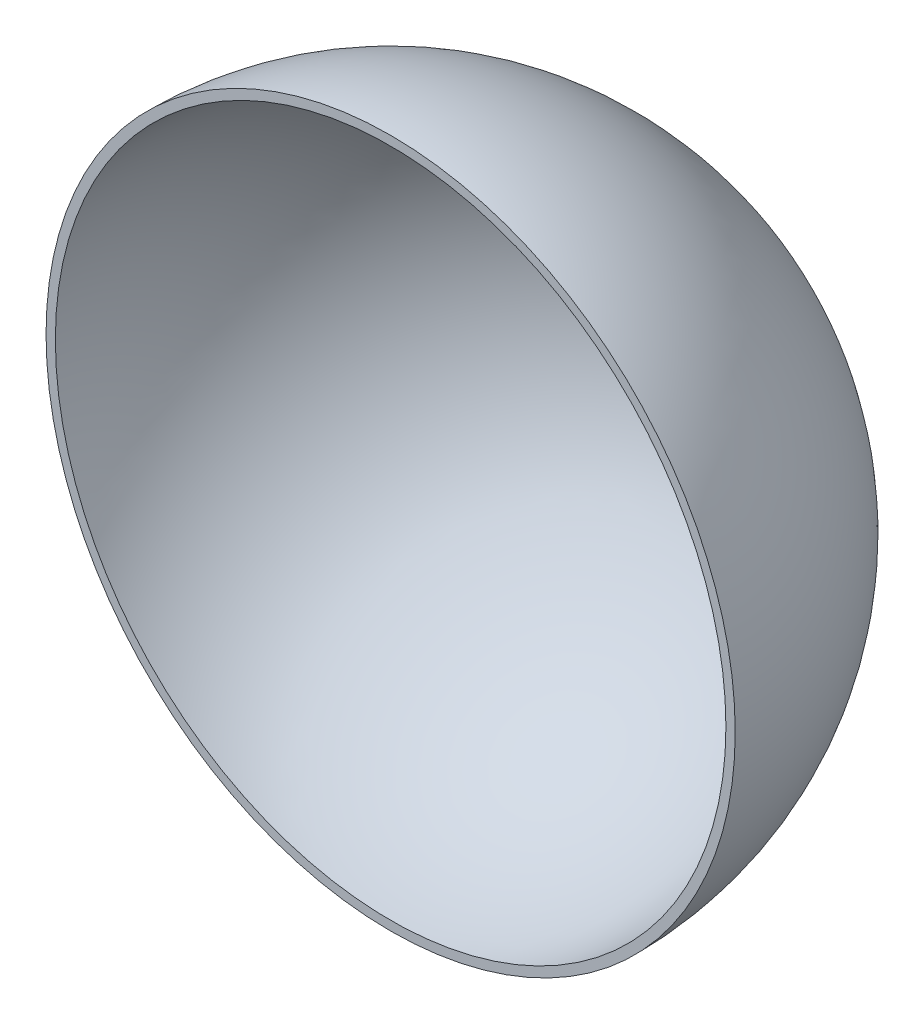
ISO-10303-21;
HEADER;
FILE_DESCRIPTION(('STEP AP214'),'2;1');
FILE_NAME('part.step','',(''),(''),'','','');
FILE_SCHEMA(('AUTOMOTIVE_DESIGN { 1 0 10303 214 1 1 1 1 }'));
ENDSEC;
DATA;
#1=APPLICATION_CONTEXT('core data for automotive mechanical design processes');
#2=APPLICATION_PROTOCOL_DEFINITION('international standard','automotive_design',2000,#1);
#3=PRODUCT_CONTEXT('',#1,'mechanical');
#4=PRODUCT('Part','Part','',(#3));
#5=PRODUCT_RELATED_PRODUCT_CATEGORY('part','',(#4));
#6=PRODUCT_DEFINITION_FORMATION('','',#4);
#7=PRODUCT_DEFINITION_CONTEXT('part definition',#1,'design');
#8=PRODUCT_DEFINITION('design','',#6,#7);
#9=PRODUCT_DEFINITION_SHAPE('','',#8);
#10=(LENGTH_UNIT() NAMED_UNIT(*) SI_UNIT(.MILLI.,.METRE.));
#11=(NAMED_UNIT(*) PLANE_ANGLE_UNIT() SI_UNIT($,.RADIAN.));
#12=(NAMED_UNIT(*) SI_UNIT($,.STERADIAN.) SOLID_ANGLE_UNIT());
#13=UNCERTAINTY_MEASURE_WITH_UNIT(LENGTH_MEASURE(1.E-05),#10,'distance_accuracy_value','');
#14=(GEOMETRIC_REPRESENTATION_CONTEXT(3) GLOBAL_UNCERTAINTY_ASSIGNED_CONTEXT((#13)) GLOBAL_UNIT_ASSIGNED_CONTEXT((#10,
#11,#12)) REPRESENTATION_CONTEXT('',''));
#15=CARTESIAN_POINT('',(0.,0.,0.));
#16=DIRECTION('',(0.,0.,1.));
#17=DIRECTION('',(1.,0.,0.));
#18=AXIS2_PLACEMENT_3D('',#15,#16,#17);
#19=CARTESIAN_POINT('',(0.,0.,0.));
#20=DIRECTION('',(0.,-1.,0.));
#21=DIRECTION('',(1.,0.,0.));
#22=AXIS2_PLACEMENT_3D('',#19,#20,#21);
#23=SPHERICAL_SURFACE('',#22,234.95);
#24=CARTESIAN_POINT('',(0.,0.,0.));
#25=DIRECTION('',(0.,0.,1.));
#26=DIRECTION('',(1.,0.,0.));
#27=AXIS2_PLACEMENT_3D('',#24,#25,#26);
#28=SPHERICAL_SURFACE('',#27,234.95);
#29=CARTESIAN_POINT('',(0.,0.,-234.864173513118));
#30=DIRECTION('',(0.,0.,1.));
#31=DIRECTION('',(1.,0.,0.));
#32=AXIS2_PLACEMENT_3D('',#29,#30,#31);
#33=CIRCLE('',#32,6.35);
#34=CARTESIAN_POINT('',(6.35,0.,-234.864173513118));
#35=VERTEX_POINT('',#34);
#36=EDGE_CURVE('E57',#35,#35,#33,.T.);
#37=ORIENTED_EDGE('',*,*,#36,.T.);
#38=EDGE_LOOP('',(#37));
#39=FACE_BOUND('',#38,.T.);
#40=CARTESIAN_POINT('',(0.,0.,0.));
#41=DIRECTION('',(0.,0.,-1.));
#42=DIRECTION('',(-1.,0.,0.));
#43=AXIS2_PLACEMENT_3D('',#40,#41,#42);
#44=CIRCLE('',#43,234.95);
#45=CARTESIAN_POINT('',(-234.95,0.,1.64064708112239E-12));
#46=VERTEX_POINT('',#45);
#47=EDGE_CURVE('E52',#46,#46,#44,.F.);
#48=ORIENTED_EDGE('',*,*,#47,.F.);
#49=EDGE_LOOP('',(#48));
#50=FACE_BOUND('',#49,.T.);
#51=ADVANCED_FACE('F43',(#39,#50),#28,.T.);
#52=CARTESIAN_POINT('',(0.,0.,0.));
#53=DIRECTION('',(0.,-1.,0.));
#54=DIRECTION('',(1.,0.,0.));
#55=AXIS2_PLACEMENT_3D('',#52,#53,#54);
#56=SPHERICAL_SURFACE('',#55,228.6);
#57=CARTESIAN_POINT('',(0.,0.,0.));
#58=DIRECTION('',(0.,0.,1.));
#59=DIRECTION('',(1.,0.,0.));
#60=AXIS2_PLACEMENT_3D('',#57,#58,#59);
#61=SPHERICAL_SURFACE('',#60,228.6);
#62=CARTESIAN_POINT('',(0.,0.,-228.511788536172));
#63=DIRECTION('',(0.,0.,1.));
#64=DIRECTION('',(1.,0.,0.));
#65=AXIS2_PLACEMENT_3D('',#62,#63,#64);
#66=CIRCLE('',#65,6.35);
#67=CARTESIAN_POINT('',(6.35,0.,-228.511788536172));
#68=VERTEX_POINT('',#67);
#69=EDGE_CURVE('E47',#68,#68,#66,.F.);
#70=ORIENTED_EDGE('',*,*,#69,.T.);
#71=EDGE_LOOP('',(#70));
#72=FACE_BOUND('',#71,.T.);
#73=CARTESIAN_POINT('',(0.,0.,0.));
#74=DIRECTION('',(0.,0.,-1.));
#75=DIRECTION('',(-1.,0.,0.));
#76=AXIS2_PLACEMENT_3D('',#73,#74,#75);
#77=CIRCLE('',#76,228.6);
#78=CARTESIAN_POINT('',(-228.6,0.,1.59630526811908E-12));
#79=VERTEX_POINT('',#78);
#80=EDGE_CURVE('E10',#79,#79,#77,.T.);
#81=ORIENTED_EDGE('',*,*,#80,.F.);
#82=EDGE_LOOP('',(#81));
#83=FACE_BOUND('',#82,.T.);
#84=ADVANCED_FACE('F45',(#72,#83),#61,.F.);
#85=CARTESIAN_POINT('',(0.,0.,0.));
#86=DIRECTION('',(0.,0.,-1.));
#87=DIRECTION('',(-1.,0.,0.));
#88=AXIS2_PLACEMENT_3D('',#85,#86,#87);
#89=PLANE('',#88);
#90=ORIENTED_EDGE('',*,*,#47,.T.);
#91=EDGE_LOOP('',(#90));
#92=FACE_BOUND('',#91,.T.);
#93=ORIENTED_EDGE('',*,*,#80,.T.);
#94=EDGE_LOOP('',(#93));
#95=FACE_BOUND('',#94,.T.);
#96=ADVANCED_FACE('F73',(#92,#95),#89,.F.);
#97=CARTESIAN_POINT('',(0.,0.,1.63757896132211E-12));
#98=DIRECTION('',(0.,0.,-1.));
#99=DIRECTION('',(-1.,0.,0.));
#100=AXIS2_PLACEMENT_3D('',#97,#98,#99);
#101=CYLINDRICAL_SURFACE('',#100,6.35);
#102=ORIENTED_EDGE('',*,*,#69,.F.);
#103=EDGE_LOOP('',(#102));
#104=FACE_BOUND('',#103,.T.);
#105=ORIENTED_EDGE('',*,*,#36,.F.);
#106=EDGE_LOOP('',(#105));
#107=FACE_BOUND('',#106,.T.);
#108=ADVANCED_FACE('F70',(#104,#107),#101,.F.);
#109=CLOSED_SHELL('',(#51,#84,#96,#108));
#110=MANIFOLD_SOLID_BREP('B2',#109);
#111=ADVANCED_BREP_SHAPE_REPRESENTATION('',(#18,#110),#14);
#112=SHAPE_DEFINITION_REPRESENTATION(#9,#111);
ENDSEC;
END-ISO-10303-21;
